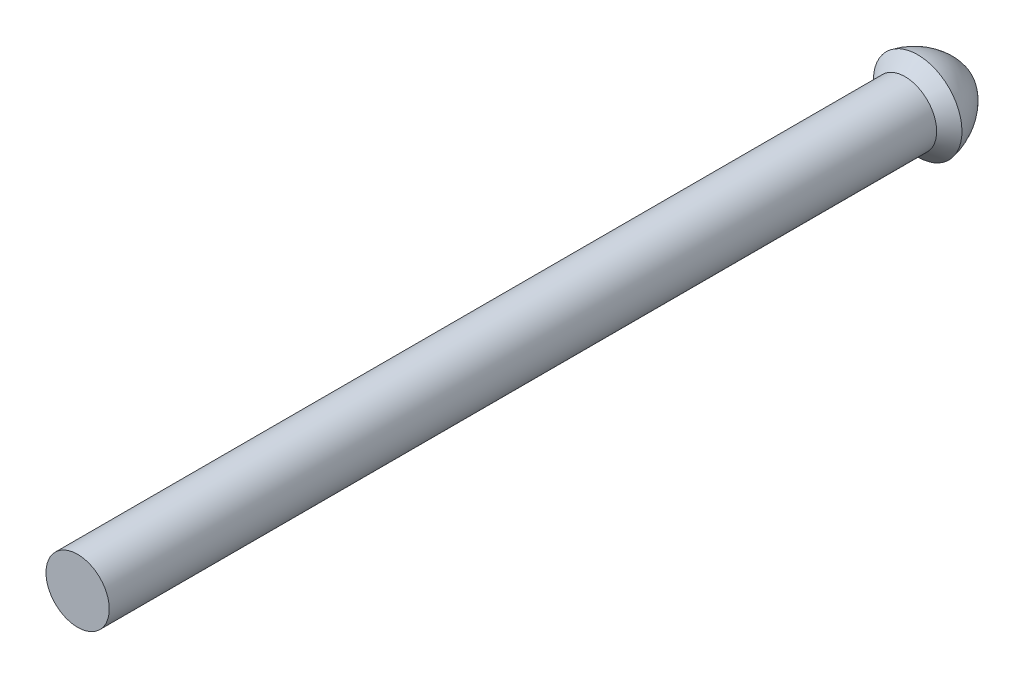
ISO-10303-21;
HEADER;
FILE_DESCRIPTION(('STEP AP214'),'2;1');
FILE_NAME('part.step','',(''),(''),'','','');
FILE_SCHEMA(('AUTOMOTIVE_DESIGN { 1 0 10303 214 1 1 1 1 }'));
ENDSEC;
DATA;
#1=APPLICATION_CONTEXT('core data for automotive mechanical design processes');
#2=APPLICATION_PROTOCOL_DEFINITION('international standard','automotive_design',2000,#1);
#3=PRODUCT_CONTEXT('',#1,'mechanical');
#4=PRODUCT('Part','Part','',(#3));
#5=PRODUCT_RELATED_PRODUCT_CATEGORY('part','',(#4));
#6=PRODUCT_DEFINITION_FORMATION('','',#4);
#7=PRODUCT_DEFINITION_CONTEXT('part definition',#1,'design');
#8=PRODUCT_DEFINITION('design','',#6,#7);
#9=PRODUCT_DEFINITION_SHAPE('','',#8);
#10=(LENGTH_UNIT() NAMED_UNIT(*) SI_UNIT(.MILLI.,.METRE.));
#11=(NAMED_UNIT(*) PLANE_ANGLE_UNIT() SI_UNIT($,.RADIAN.));
#12=(NAMED_UNIT(*) SI_UNIT($,.STERADIAN.) SOLID_ANGLE_UNIT());
#13=UNCERTAINTY_MEASURE_WITH_UNIT(LENGTH_MEASURE(1.E-05),#10,'distance_accuracy_value','');
#14=(GEOMETRIC_REPRESENTATION_CONTEXT(3) GLOBAL_UNCERTAINTY_ASSIGNED_CONTEXT((#13)) GLOBAL_UNIT_ASSIGNED_CONTEXT((#10,
#11,#12)) REPRESENTATION_CONTEXT('',''));
#15=CARTESIAN_POINT('',(0.,0.,0.));
#16=DIRECTION('',(0.,0.,1.));
#17=DIRECTION('',(1.,0.,0.));
#18=AXIS2_PLACEMENT_3D('',#15,#16,#17);
#19=CARTESIAN_POINT('',(0.,0.,0.));
#20=DIRECTION('',(0.,0.,-1.));
#21=DIRECTION('',(0.,1.,0.));
#22=AXIS2_PLACEMENT_3D('',#19,#20,#21);
#23=PLANE('',#22);
#24=CARTESIAN_POINT('',(0.,0.,0.));
#25=DIRECTION('',(0.,0.,1.));
#26=DIRECTION('',(0.,-1.,0.));
#27=AXIS2_PLACEMENT_3D('',#24,#25,#26);
#28=CIRCLE('',#27,3.81);
#29=CARTESIAN_POINT('',(0.,-3.81,0.));
#30=VERTEX_POINT('',#29);
#31=EDGE_CURVE('E62',#30,#30,#28,.T.);
#32=ORIENTED_EDGE('',*,*,#31,.T.);
#33=EDGE_LOOP('',(#32));
#34=FACE_BOUND('',#33,.T.);
#35=ADVANCED_FACE('F32',(#34),#23,.F.);
#36=CARTESIAN_POINT('',(0.,2.54,-99.6298533835525));
#37=DIRECTION('',(-1.,0.,0.));
#38=DIRECTION('',(0.,-1.,0.));
#39=AXIS2_PLACEMENT_3D('',#36,#37,#38);
#40=CIRCLE('',#39,8.02012792915425);
#41=TRIMMED_CURVE('',#40,(PARAMETER_VALUE(-1.24854460269553)),
(PARAMETER_VALUE(1.24854460269553)),.T.,.PARAMETER.);
#42=CARTESIAN_POINT('',(0.,0.,-99.6298533835525));
#43=DIRECTION('',(0.,0.,1.));
#44=AXIS1_PLACEMENT('',#42,#43);
#45=SURFACE_OF_REVOLUTION('',#41,#44);
#46=CARTESIAN_POINT('',(0.,0.,-101.153853383553));
#47=DIRECTION('',(0.,0.,1.));
#48=DIRECTION('',(0.,-1.,0.));
#49=AXIS2_PLACEMENT_3D('',#46,#47,#48);
#50=CIRCLE('',#49,5.334);
#51=CARTESIAN_POINT('',(0.,-5.334,-101.153853383553));
#52=VERTEX_POINT('',#51);
#53=EDGE_CURVE('E11',#52,#52,#50,.T.);
#54=ORIENTED_EDGE('',*,*,#53,.F.);
#55=EDGE_LOOP('',(#54));
#56=FACE_BOUND('',#55,.T.);
#57=CARTESIAN_POINT('',(0.,0.,-107.237142782543));
#58=VERTEX_POINT('',#57);
#59=VERTEX_LOOP('',#58);
#60=FACE_BOUND('',#59,.T.);
#61=ADVANCED_FACE('F41',(#56,#60),#45,.T.);
#62=CARTESIAN_POINT('',(0.,0.,-101.153853383553));
#63=DIRECTION('',(0.,0.,-1.));
#64=DIRECTION('',(0.,1.,0.));
#65=AXIS2_PLACEMENT_3D('',#62,#63,#64);
#66=CONICAL_SURFACE('',#65,5.334,0.785398163397449);
#67=CARTESIAN_POINT('',(0.,0.,-99.6298533835525));
#68=DIRECTION('',(0.,0.,1.));
#69=DIRECTION('',(0.,-1.,0.));
#70=AXIS2_PLACEMENT_3D('',#67,#68,#69);
#71=CIRCLE('',#70,3.81);
#72=CARTESIAN_POINT('',(0.,-3.81,-99.6298533835525));
#73=VERTEX_POINT('',#72);
#74=EDGE_CURVE('E38',#73,#73,#71,.T.);
#75=ORIENTED_EDGE('',*,*,#74,.F.);
#76=EDGE_LOOP('',(#75));
#77=FACE_BOUND('',#76,.T.);
#78=ORIENTED_EDGE('',*,*,#53,.T.);
#79=EDGE_LOOP('',(#78));
#80=FACE_BOUND('',#79,.T.);
#81=ADVANCED_FACE('F43',(#77,#80),#66,.T.);
#82=CARTESIAN_POINT('',(0.,0.,0.));
#83=DIRECTION('',(0.,0.,1.));
#84=DIRECTION('',(0.,-1.,0.));
#85=AXIS2_PLACEMENT_3D('',#82,#83,#84);
#86=CYLINDRICAL_SURFACE('',#85,3.81);
#87=ORIENTED_EDGE('',*,*,#31,.F.);
#88=EDGE_LOOP('',(#87));
#89=FACE_BOUND('',#88,.T.);
#90=ORIENTED_EDGE('',*,*,#74,.T.);
#91=EDGE_LOOP('',(#90));
#92=FACE_BOUND('',#91,.T.);
#93=ADVANCED_FACE('F49',(#89,#92),#86,.T.);
#94=CLOSED_SHELL('',(#35,#61,#81,#93));
#95=MANIFOLD_SOLID_BREP('B2',#94);
#96=ADVANCED_BREP_SHAPE_REPRESENTATION('',(#18,#95),#14);
#97=SHAPE_DEFINITION_REPRESENTATION(#9,#96);
ENDSEC;
END-ISO-10303-21;
